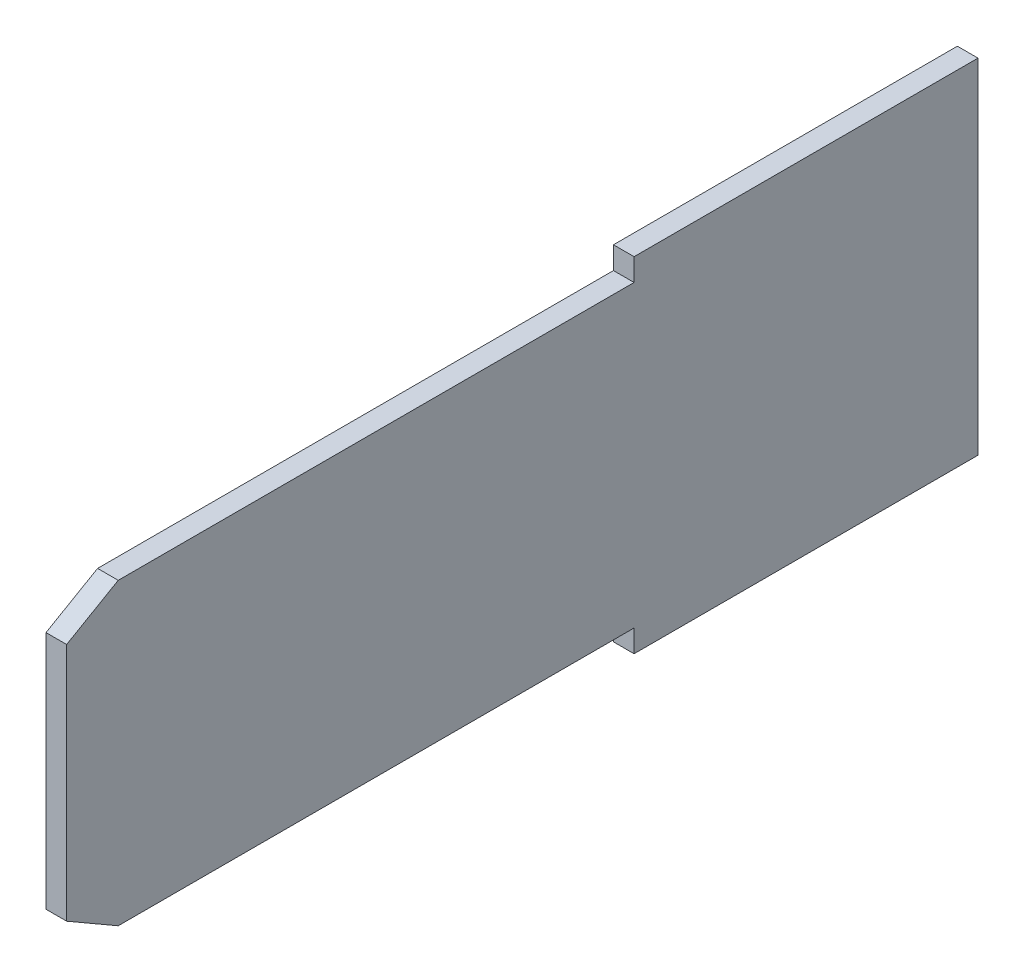
ISO-10303-21;
HEADER;
FILE_DESCRIPTION(('STEP AP214'),'2;1');
FILE_NAME('part.step','',(''),(''),'','','');
FILE_SCHEMA(('AUTOMOTIVE_DESIGN { 1 0 10303 214 1 1 1 1 }'));
ENDSEC;
DATA;
#1=APPLICATION_CONTEXT('core data for automotive mechanical design processes');
#2=APPLICATION_PROTOCOL_DEFINITION('international standard','automotive_design',2000,#1);
#3=PRODUCT_CONTEXT('',#1,'mechanical');
#4=PRODUCT('Part','Part','',(#3));
#5=PRODUCT_RELATED_PRODUCT_CATEGORY('part','',(#4));
#6=PRODUCT_DEFINITION_FORMATION('','',#4);
#7=PRODUCT_DEFINITION_CONTEXT('part definition',#1,'design');
#8=PRODUCT_DEFINITION('design','',#6,#7);
#9=PRODUCT_DEFINITION_SHAPE('','',#8);
#10=(LENGTH_UNIT() NAMED_UNIT(*) SI_UNIT(.MILLI.,.METRE.));
#11=(NAMED_UNIT(*) PLANE_ANGLE_UNIT() SI_UNIT($,.RADIAN.));
#12=(NAMED_UNIT(*) SI_UNIT($,.STERADIAN.) SOLID_ANGLE_UNIT());
#13=UNCERTAINTY_MEASURE_WITH_UNIT(LENGTH_MEASURE(1.E-05),#10,'distance_accuracy_value','');
#14=(GEOMETRIC_REPRESENTATION_CONTEXT(3) GLOBAL_UNCERTAINTY_ASSIGNED_CONTEXT((#13)) GLOBAL_UNIT_ASSIGNED_CONTEXT((#10,
#11,#12)) REPRESENTATION_CONTEXT('',''));
#15=CARTESIAN_POINT('',(0.,0.,0.));
#16=DIRECTION('',(0.,0.,1.));
#17=DIRECTION('',(1.,0.,0.));
#18=AXIS2_PLACEMENT_3D('',#15,#16,#17);
#19=CARTESIAN_POINT('',(3.,-50.0000000000035,0.));
#20=DIRECTION('',(0.,0.,-1.));
#21=DIRECTION('',(0.,1.,0.));
#22=AXIS2_PLACEMENT_3D('',#19,#20,#21);
#23=PLANE('',#22);
#24=DIRECTION('',(0.,-1.,0.));
#25=VECTOR('',#24,1.);
#26=CARTESIAN_POINT('',(-3.,-50.0000000000035,0.));
#27=LINE('',#26,#25);
#28=CARTESIAN_POINT('',(-3.,-43.5000000000035,0.));
#29=VERTEX_POINT('',#28);
#30=CARTESIAN_POINT('',(-3.,-50.0000000000035,0.));
#31=VERTEX_POINT('',#30);
#32=EDGE_CURVE('E144',#29,#31,#27,.T.);
#33=ORIENTED_EDGE('',*,*,#32,.T.);
#34=DIRECTION('',(-1.,0.,0.));
#35=VECTOR('',#34,1.);
#36=CARTESIAN_POINT('',(3.,-50.0000000000035,0.));
#37=LINE('',#36,#35);
#38=CARTESIAN_POINT('',(3.,-50.0000000000035,0.));
#39=VERTEX_POINT('',#38);
#40=EDGE_CURVE('E11',#39,#31,#37,.T.);
#41=ORIENTED_EDGE('',*,*,#40,.F.);
#42=DIRECTION('',(0.,-1.,0.));
#43=VECTOR('',#42,1.);
#44=CARTESIAN_POINT('',(3.,-50.0000000000035,0.));
#45=LINE('',#44,#43);
#46=CARTESIAN_POINT('',(3.,-43.5000000000035,0.));
#47=VERTEX_POINT('',#46);
#48=EDGE_CURVE('E162',#47,#39,#45,.T.);
#49=ORIENTED_EDGE('',*,*,#48,.F.);
#50=DIRECTION('',(-1.,0.,0.));
#51=VECTOR('',#50,1.);
#52=CARTESIAN_POINT('',(3.,-43.5000000000035,0.));
#53=LINE('',#52,#51);
#54=EDGE_CURVE('E140',#47,#29,#53,.T.);
#55=ORIENTED_EDGE('',*,*,#54,.T.);
#56=EDGE_LOOP('',(#33,#41,#49,#55));
#57=FACE_BOUND('',#56,.T.);
#58=ADVANCED_FACE('F36',(#57),#23,.F.);
#59=CARTESIAN_POINT('',(3.,-50.0000000000035,-100.));
#60=DIRECTION('',(0.,1.,0.));
#61=DIRECTION('',(0.,0.,1.));
#62=AXIS2_PLACEMENT_3D('',#59,#60,#61);
#63=PLANE('',#62);
#64=DIRECTION('',(0.,0.,-1.));
#65=VECTOR('',#64,1.);
#66=CARTESIAN_POINT('',(-3.,-50.0000000000035,-100.));
#67=LINE('',#66,#65);
#68=CARTESIAN_POINT('',(-3.,-50.0000000000035,-100.));
#69=VERTEX_POINT('',#68);
#70=EDGE_CURVE('E147',#31,#69,#67,.T.);
#71=ORIENTED_EDGE('',*,*,#70,.T.);
#72=DIRECTION('',(-1.,0.,0.));
#73=VECTOR('',#72,1.);
#74=CARTESIAN_POINT('',(3.,-50.0000000000035,-100.));
#75=LINE('',#74,#73);
#76=CARTESIAN_POINT('',(3.,-50.0000000000035,-100.));
#77=VERTEX_POINT('',#76);
#78=EDGE_CURVE('E44',#77,#69,#75,.T.);
#79=ORIENTED_EDGE('',*,*,#78,.F.);
#80=DIRECTION('',(0.,0.,-1.));
#81=VECTOR('',#80,1.);
#82=CARTESIAN_POINT('',(3.,-50.0000000000035,-100.));
#83=LINE('',#82,#81);
#84=EDGE_CURVE('E101',#39,#77,#83,.T.);
#85=ORIENTED_EDGE('',*,*,#84,.F.);
#86=ORIENTED_EDGE('',*,*,#40,.T.);
#87=EDGE_LOOP('',(#71,#79,#85,#86));
#88=FACE_BOUND('',#87,.T.);
#89=ADVANCED_FACE('F211',(#88),#63,.F.);
#90=CARTESIAN_POINT('',(3.,-50.0000000000035,-100.));
#91=DIRECTION('',(0.,0.,1.));
#92=DIRECTION('',(1.,0.,0.));
#93=AXIS2_PLACEMENT_3D('',#90,#91,#92);
#94=PLANE('',#93);
#95=DIRECTION('',(0.,1.,0.));
#96=VECTOR('',#95,1.);
#97=CARTESIAN_POINT('',(-3.,-50.0000000000035,-100.));
#98=LINE('',#97,#96);
#99=CARTESIAN_POINT('',(-3.,50.0000000000035,-100.));
#100=VERTEX_POINT('',#99);
#101=EDGE_CURVE('E149',#69,#100,#98,.T.);
#102=ORIENTED_EDGE('',*,*,#101,.T.);
#103=DIRECTION('',(-1.,0.,0.));
#104=VECTOR('',#103,1.);
#105=CARTESIAN_POINT('',(3.,50.0000000000035,-100.));
#106=LINE('',#105,#104);
#107=CARTESIAN_POINT('',(3.,50.0000000000035,-100.));
#108=VERTEX_POINT('',#107);
#109=EDGE_CURVE('E175',#108,#100,#106,.T.);
#110=ORIENTED_EDGE('',*,*,#109,.F.);
#111=DIRECTION('',(0.,1.,0.));
#112=VECTOR('',#111,1.);
#113=CARTESIAN_POINT('',(3.,-50.0000000000035,-100.));
#114=LINE('',#113,#112);
#115=EDGE_CURVE('E183',#77,#108,#114,.T.);
#116=ORIENTED_EDGE('',*,*,#115,.F.);
#117=ORIENTED_EDGE('',*,*,#78,.T.);
#118=EDGE_LOOP('',(#102,#110,#116,#117));
#119=FACE_BOUND('',#118,.T.);
#120=ADVANCED_FACE('F181',(#119),#94,.F.);
#121=CARTESIAN_POINT('',(3.,50.0000000000035,-100.));
#122=DIRECTION('',(0.,-1.,0.));
#123=DIRECTION('',(0.,0.,-1.));
#124=AXIS2_PLACEMENT_3D('',#121,#122,#123);
#125=PLANE('',#124);
#126=DIRECTION('',(0.,0.,1.));
#127=VECTOR('',#126,1.);
#128=CARTESIAN_POINT('',(-3.,50.0000000000035,-100.));
#129=LINE('',#128,#127);
#130=CARTESIAN_POINT('',(-3.,50.0000000000035,0.));
#131=VERTEX_POINT('',#130);
#132=EDGE_CURVE('E151',#100,#131,#129,.T.);
#133=ORIENTED_EDGE('',*,*,#132,.T.);
#134=DIRECTION('',(-1.,0.,0.));
#135=VECTOR('',#134,1.);
#136=CARTESIAN_POINT('',(3.,50.0000000000035,0.));
#137=LINE('',#136,#135);
#138=CARTESIAN_POINT('',(3.,50.0000000000035,0.));
#139=VERTEX_POINT('',#138);
#140=EDGE_CURVE('E172',#139,#131,#137,.T.);
#141=ORIENTED_EDGE('',*,*,#140,.F.);
#142=DIRECTION('',(0.,0.,1.));
#143=VECTOR('',#142,1.);
#144=CARTESIAN_POINT('',(3.,50.0000000000035,-100.));
#145=LINE('',#144,#143);
#146=EDGE_CURVE('E201',#108,#139,#145,.T.);
#147=ORIENTED_EDGE('',*,*,#146,.F.);
#148=ORIENTED_EDGE('',*,*,#109,.T.);
#149=EDGE_LOOP('',(#133,#141,#147,#148));
#150=FACE_BOUND('',#149,.T.);
#151=ADVANCED_FACE('F192',(#150),#125,.F.);
#152=CARTESIAN_POINT('',(3.,50.0000000000035,0.));
#153=DIRECTION('',(0.,0.,-1.));
#154=DIRECTION('',(0.,1.,0.));
#155=AXIS2_PLACEMENT_3D('',#152,#153,#154);
#156=PLANE('',#155);
#157=DIRECTION('',(0.,-1.,0.));
#158=VECTOR('',#157,1.);
#159=CARTESIAN_POINT('',(-3.,50.0000000000035,0.));
#160=LINE('',#159,#158);
#161=CARTESIAN_POINT('',(-3.,43.5000000000035,0.));
#162=VERTEX_POINT('',#161);
#163=EDGE_CURVE('E153',#131,#162,#160,.T.);
#164=ORIENTED_EDGE('',*,*,#163,.T.);
#165=DIRECTION('',(-1.,0.,0.));
#166=VECTOR('',#165,1.);
#167=CARTESIAN_POINT('',(3.,43.5000000000035,0.));
#168=LINE('',#167,#166);
#169=CARTESIAN_POINT('',(3.,43.5000000000035,0.));
#170=VERTEX_POINT('',#169);
#171=EDGE_CURVE('E169',#170,#162,#168,.T.);
#172=ORIENTED_EDGE('',*,*,#171,.F.);
#173=DIRECTION('',(0.,-1.,0.));
#174=VECTOR('',#173,1.);
#175=CARTESIAN_POINT('',(3.,50.0000000000035,0.));
#176=LINE('',#175,#174);
#177=EDGE_CURVE('E198',#139,#170,#176,.T.);
#178=ORIENTED_EDGE('',*,*,#177,.F.);
#179=ORIENTED_EDGE('',*,*,#140,.T.);
#180=EDGE_LOOP('',(#164,#172,#178,#179));
#181=FACE_BOUND('',#180,.T.);
#182=ADVANCED_FACE('F196',(#181),#156,.F.);
#183=CARTESIAN_POINT('',(3.,43.5000000000035,0.));
#184=DIRECTION('',(0.,-1.,0.));
#185=DIRECTION('',(0.,0.,-1.));
#186=AXIS2_PLACEMENT_3D('',#183,#184,#185);
#187=PLANE('',#186);
#188=DIRECTION('',(0.,0.,1.));
#189=VECTOR('',#188,1.);
#190=CARTESIAN_POINT('',(-3.,43.5000000000035,0.));
#191=LINE('',#190,#189);
#192=CARTESIAN_POINT('',(-3.,43.5000000000035,150.));
#193=VERTEX_POINT('',#192);
#194=EDGE_CURVE('E155',#162,#193,#191,.T.);
#195=ORIENTED_EDGE('',*,*,#194,.T.);
#196=DIRECTION('',(-1.,0.,0.));
#197=VECTOR('',#196,1.);
#198=CARTESIAN_POINT('',(3.,43.5000000000035,150.));
#199=LINE('',#198,#197);
#200=CARTESIAN_POINT('',(3.,43.5000000000035,150.));
#201=VERTEX_POINT('',#200);
#202=EDGE_CURVE('E166',#201,#193,#199,.T.);
#203=ORIENTED_EDGE('',*,*,#202,.F.);
#204=DIRECTION('',(0.,0.,1.));
#205=VECTOR('',#204,1.);
#206=CARTESIAN_POINT('',(3.,43.5000000000035,0.));
#207=LINE('',#206,#205);
#208=EDGE_CURVE('E200',#170,#201,#207,.T.);
#209=ORIENTED_EDGE('',*,*,#208,.F.);
#210=ORIENTED_EDGE('',*,*,#171,.T.);
#211=EDGE_LOOP('',(#195,#203,#209,#210));
#212=FACE_BOUND('',#211,.T.);
#213=ADVANCED_FACE('F223',(#212),#187,.F.);
#214=CARTESIAN_POINT('',(3.,43.5000000000035,150.));
#215=DIRECTION('',(0.,-0.866025403784438,-0.500000000000001));
#216=DIRECTION('',(0.,0.500000000000001,-0.866025403784438));
#217=AXIS2_PLACEMENT_3D('',#214,#215,#216);
#218=PLANE('',#217);
#219=DIRECTION('',(0.,-0.500000000000001,0.866025403784438));
#220=VECTOR('',#219,1.);
#221=CARTESIAN_POINT('',(-3.,43.5000000000035,150.));
#222=LINE('',#221,#220);
#223=CARTESIAN_POINT('',(-3.,34.839745962159,165.));
#224=VERTEX_POINT('',#223);
#225=EDGE_CURVE('E157',#193,#224,#222,.T.);
#226=ORIENTED_EDGE('',*,*,#225,.T.);
#227=DIRECTION('',(-1.,0.,0.));
#228=VECTOR('',#227,1.);
#229=CARTESIAN_POINT('',(3.,34.839745962159,165.));
#230=LINE('',#229,#228);
#231=CARTESIAN_POINT('',(3.,34.839745962159,165.));
#232=VERTEX_POINT('',#231);
#233=EDGE_CURVE('E135',#232,#224,#230,.T.);
#234=ORIENTED_EDGE('',*,*,#233,.F.);
#235=DIRECTION('',(0.,-0.500000000000001,0.866025403784438));
#236=VECTOR('',#235,1.);
#237=CARTESIAN_POINT('',(3.,43.5000000000035,150.));
#238=LINE('',#237,#236);
#239=EDGE_CURVE('E126',#201,#232,#238,.T.);
#240=ORIENTED_EDGE('',*,*,#239,.F.);
#241=ORIENTED_EDGE('',*,*,#202,.T.);
#242=EDGE_LOOP('',(#226,#234,#240,#241));
#243=FACE_BOUND('',#242,.T.);
#244=ADVANCED_FACE('F226',(#243),#218,.F.);
#245=CARTESIAN_POINT('',(3.,34.839745962159,165.));
#246=DIRECTION('',(0.,0.,-1.));
#247=DIRECTION('',(-1.,0.,0.));
#248=AXIS2_PLACEMENT_3D('',#245,#246,#247);
#249=PLANE('',#248);
#250=DIRECTION('',(0.,-1.,0.));
#251=VECTOR('',#250,1.);
#252=CARTESIAN_POINT('',(-3.,34.839745962159,165.));
#253=LINE('',#252,#251);
#254=CARTESIAN_POINT('',(-3.,-34.839745962159,165.));
#255=VERTEX_POINT('',#254);
#256=EDGE_CURVE('E134',#224,#255,#253,.T.);
#257=ORIENTED_EDGE('',*,*,#256,.T.);
#258=DIRECTION('',(-1.,0.,0.));
#259=VECTOR('',#258,1.);
#260=CARTESIAN_POINT('',(3.,-34.839745962159,165.));
#261=LINE('',#260,#259);
#262=CARTESIAN_POINT('',(3.,-34.839745962159,165.));
#263=VERTEX_POINT('',#262);
#264=EDGE_CURVE('E131',#263,#255,#261,.T.);
#265=ORIENTED_EDGE('',*,*,#264,.F.);
#266=DIRECTION('',(0.,-1.,0.));
#267=VECTOR('',#266,1.);
#268=CARTESIAN_POINT('',(3.,34.839745962159,165.));
#269=LINE('',#268,#267);
#270=EDGE_CURVE('E120',#232,#263,#269,.T.);
#271=ORIENTED_EDGE('',*,*,#270,.F.);
#272=ORIENTED_EDGE('',*,*,#233,.T.);
#273=EDGE_LOOP('',(#257,#265,#271,#272));
#274=FACE_BOUND('',#273,.T.);
#275=ADVANCED_FACE('F132',(#274),#249,.F.);
#276=CARTESIAN_POINT('',(3.,-43.5000000000035,150.));
#277=DIRECTION('',(0.,0.866025403784438,-0.500000000000001));
#278=DIRECTION('',(0.,0.500000000000001,0.866025403784438));
#279=AXIS2_PLACEMENT_3D('',#276,#277,#278);
#280=PLANE('',#279);
#281=DIRECTION('',(0.,-0.500000000000001,-0.866025403784438));
#282=VECTOR('',#281,1.);
#283=CARTESIAN_POINT('',(-3.,-43.5000000000035,150.));
#284=LINE('',#283,#282);
#285=CARTESIAN_POINT('',(-3.,-43.5000000000035,150.));
#286=VERTEX_POINT('',#285);
#287=EDGE_CURVE('E87',#255,#286,#284,.T.);
#288=ORIENTED_EDGE('',*,*,#287,.T.);
#289=DIRECTION('',(-1.,0.,0.));
#290=VECTOR('',#289,1.);
#291=CARTESIAN_POINT('',(3.,-43.5000000000035,150.));
#292=LINE('',#291,#290);
#293=CARTESIAN_POINT('',(3.,-43.5000000000035,150.));
#294=VERTEX_POINT('',#293);
#295=EDGE_CURVE('E136',#294,#286,#292,.T.);
#296=ORIENTED_EDGE('',*,*,#295,.F.);
#297=DIRECTION('',(0.,-0.500000000000001,-0.866025403784438));
#298=VECTOR('',#297,1.);
#299=CARTESIAN_POINT('',(3.,-43.5000000000035,150.));
#300=LINE('',#299,#298);
#301=EDGE_CURVE('E124',#263,#294,#300,.T.);
#302=ORIENTED_EDGE('',*,*,#301,.F.);
#303=ORIENTED_EDGE('',*,*,#264,.T.);
#304=EDGE_LOOP('',(#288,#296,#302,#303));
#305=FACE_BOUND('',#304,.T.);
#306=ADVANCED_FACE('F138',(#305),#280,.F.);
#307=CARTESIAN_POINT('',(3.,-43.5000000000035,0.));
#308=DIRECTION('',(0.,1.,0.));
#309=DIRECTION('',(0.,0.,1.));
#310=AXIS2_PLACEMENT_3D('',#307,#308,#309);
#311=PLANE('',#310);
#312=DIRECTION('',(0.,0.,-1.));
#313=VECTOR('',#312,1.);
#314=CARTESIAN_POINT('',(-3.,-43.5000000000035,0.));
#315=LINE('',#314,#313);
#316=EDGE_CURVE('E93',#286,#29,#315,.T.);
#317=ORIENTED_EDGE('',*,*,#316,.T.);
#318=ORIENTED_EDGE('',*,*,#54,.F.);
#319=DIRECTION('',(0.,0.,-1.));
#320=VECTOR('',#319,1.);
#321=CARTESIAN_POINT('',(3.,-43.5000000000035,0.));
#322=LINE('',#321,#320);
#323=EDGE_CURVE('E52',#294,#47,#322,.T.);
#324=ORIENTED_EDGE('',*,*,#323,.F.);
#325=ORIENTED_EDGE('',*,*,#295,.T.);
#326=EDGE_LOOP('',(#317,#318,#324,#325));
#327=FACE_BOUND('',#326,.T.);
#328=ADVANCED_FACE('F235',(#327),#311,.F.);
#329=CARTESIAN_POINT('',(3.,0.,0.));
#330=DIRECTION('',(1.,0.,0.));
#331=DIRECTION('',(0.,0.,-1.));
#332=AXIS2_PLACEMENT_3D('',#329,#330,#331);
#333=PLANE('',#332);
#334=ORIENTED_EDGE('',*,*,#48,.T.);
#335=ORIENTED_EDGE('',*,*,#84,.T.);
#336=ORIENTED_EDGE('',*,*,#115,.T.);
#337=ORIENTED_EDGE('',*,*,#146,.T.);
#338=ORIENTED_EDGE('',*,*,#177,.T.);
#339=ORIENTED_EDGE('',*,*,#208,.T.);
#340=ORIENTED_EDGE('',*,*,#239,.T.);
#341=ORIENTED_EDGE('',*,*,#270,.T.);
#342=ORIENTED_EDGE('',*,*,#301,.T.);
#343=ORIENTED_EDGE('',*,*,#323,.T.);
#344=EDGE_LOOP('',(#334,#335,#336,#337,#338,#339,#340,#341,#342,#343));
#345=FACE_BOUND('',#344,.T.);
#346=ADVANCED_FACE('F122',(#345),#333,.T.);
#347=CARTESIAN_POINT('',(-3.,0.,0.));
#348=DIRECTION('',(1.,0.,0.));
#349=DIRECTION('',(0.,0.,-1.));
#350=AXIS2_PLACEMENT_3D('',#347,#348,#349);
#351=PLANE('',#350);
#352=ORIENTED_EDGE('',*,*,#32,.F.);
#353=ORIENTED_EDGE('',*,*,#316,.F.);
#354=ORIENTED_EDGE('',*,*,#287,.F.);
#355=ORIENTED_EDGE('',*,*,#256,.F.);
#356=ORIENTED_EDGE('',*,*,#225,.F.);
#357=ORIENTED_EDGE('',*,*,#194,.F.);
#358=ORIENTED_EDGE('',*,*,#163,.F.);
#359=ORIENTED_EDGE('',*,*,#132,.F.);
#360=ORIENTED_EDGE('',*,*,#101,.F.);
#361=ORIENTED_EDGE('',*,*,#70,.F.);
#362=EDGE_LOOP('',(#352,#353,#354,#355,#356,#357,#358,#359,#360,#361));
#363=FACE_BOUND('',#362,.T.);
#364=ADVANCED_FACE('F187',(#363),#351,.F.);
#365=CLOSED_SHELL('',(#58,#89,#120,#151,#182,#213,#244,#275,#306,#328,#346,#364));
#366=MANIFOLD_SOLID_BREP('B2',#365);
#367=ADVANCED_BREP_SHAPE_REPRESENTATION('',(#18,#366),#14);
#368=SHAPE_DEFINITION_REPRESENTATION(#9,#367);
ENDSEC;
END-ISO-10303-21;
